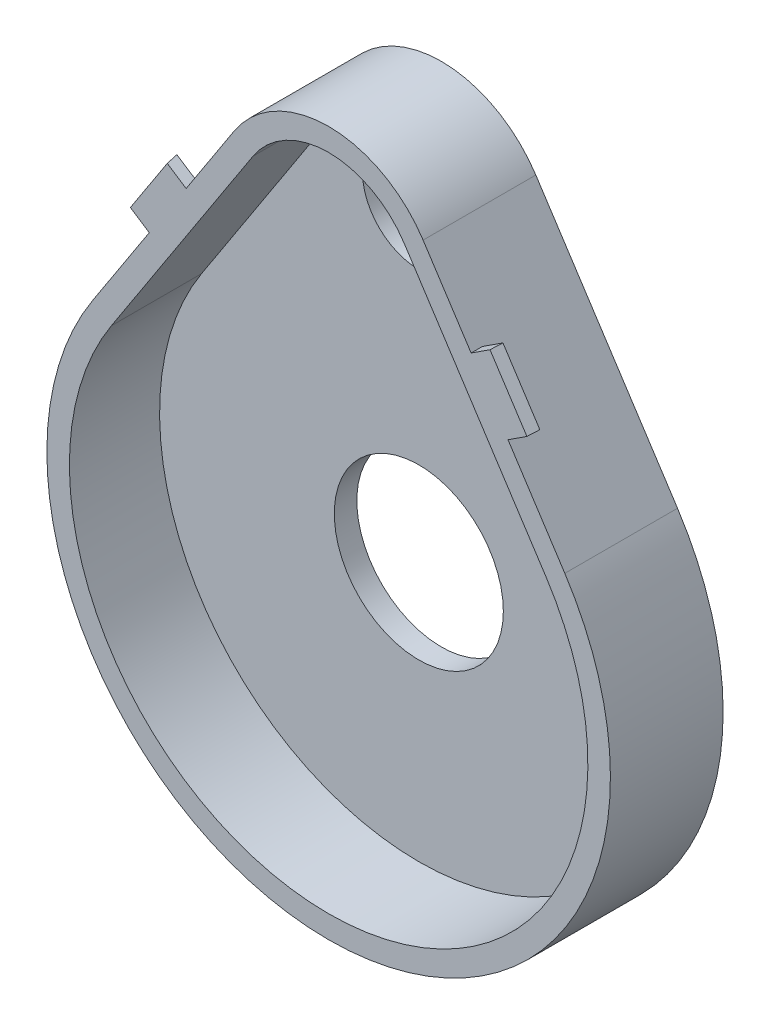
ISO-10303-21;
HEADER;
FILE_DESCRIPTION(('STEP AP214'),'2;1');
FILE_NAME('part.step','',(''),(''),'','','');
FILE_SCHEMA(('AUTOMOTIVE_DESIGN { 1 0 10303 214 1 1 1 1 }'));
ENDSEC;
DATA;
#1=APPLICATION_CONTEXT('core data for automotive mechanical design processes');
#2=APPLICATION_PROTOCOL_DEFINITION('international standard','automotive_design',2000,#1);
#3=PRODUCT_CONTEXT('',#1,'mechanical');
#4=PRODUCT('Part','Part','',(#3));
#5=PRODUCT_RELATED_PRODUCT_CATEGORY('part','',(#4));
#6=PRODUCT_DEFINITION_FORMATION('','',#4);
#7=PRODUCT_DEFINITION_CONTEXT('part definition',#1,'design');
#8=PRODUCT_DEFINITION('design','',#6,#7);
#9=PRODUCT_DEFINITION_SHAPE('','',#8);
#10=(LENGTH_UNIT() NAMED_UNIT(*) SI_UNIT(.MILLI.,.METRE.));
#11=(NAMED_UNIT(*) PLANE_ANGLE_UNIT() SI_UNIT($,.RADIAN.));
#12=(NAMED_UNIT(*) SI_UNIT($,.STERADIAN.) SOLID_ANGLE_UNIT());
#13=UNCERTAINTY_MEASURE_WITH_UNIT(LENGTH_MEASURE(1.E-05),#10,'distance_accuracy_value','');
#14=(GEOMETRIC_REPRESENTATION_CONTEXT(3) GLOBAL_UNCERTAINTY_ASSIGNED_CONTEXT((#13)) GLOBAL_UNIT_ASSIGNED_CONTEXT((#10,
#11,#12)) REPRESENTATION_CONTEXT('',''));
#15=CARTESIAN_POINT('',(0.,0.,0.));
#16=DIRECTION('',(0.,0.,1.));
#17=DIRECTION('',(1.,0.,0.));
#18=AXIS2_PLACEMENT_3D('',#15,#16,#17);
#19=CARTESIAN_POINT('',(-13.3054789326841,8.65909090909091,6.35));
#20=DIRECTION('',(-0.838140405208444,0.545454545454546,0.));
#21=DIRECTION('',(-0.545454545454546,-0.838140405208444,0.));
#22=AXIS2_PLACEMENT_3D('',#19,#20,#21);
#23=PLANE('',#22);
#24=DIRECTION('',(0.545454545454546,0.838140405208444,0.));
#25=VECTOR('',#24,1.);
#26=CARTESIAN_POINT('',(-13.3054789326841,8.65909090909091,6.35));
#27=LINE('',#26,#25);
#28=CARTESIAN_POINT('',(-13.3054789326841,8.65909090909091,6.35));
#29=VERTEX_POINT('',#28);
#30=CARTESIAN_POINT('',(-10.105298990747,13.5764577834285,6.35));
#31=VERTEX_POINT('',#30);
#32=EDGE_CURVE('E171',#29,#31,#27,.T.);
#33=ORIENTED_EDGE('',*,*,#32,.T.);
#34=DIRECTION('',(0.,0.,-1.));
#35=VECTOR('',#34,1.);
#36=CARTESIAN_POINT('',(-10.105298990747,13.5764577834285,11.3477380291522));
#37=LINE('',#36,#35);
#38=CARTESIAN_POINT('',(-10.105298990747,13.5764577834285,5.715));
#39=VERTEX_POINT('',#38);
#40=EDGE_CURVE('E86',#31,#39,#37,.T.);
#41=ORIENTED_EDGE('',*,*,#40,.T.);
#42=DIRECTION('',(0.545454545454545,0.838140405208444,0.));
#43=VECTOR('',#42,1.);
#44=CARTESIAN_POINT('',(-8.02711717256517,16.7697727272727,5.715));
#45=LINE('',#44,#43);
#46=CARTESIAN_POINT('',(-8.02711717256517,16.7697727272727,5.715));
#47=VERTEX_POINT('',#46);
#48=EDGE_CURVE('E248',#39,#47,#45,.T.);
#49=ORIENTED_EDGE('',*,*,#48,.T.);
#50=DIRECTION('',(0.,0.,-1.));
#51=VECTOR('',#50,1.);
#52=CARTESIAN_POINT('',(-8.02711717256517,16.7697727272727,11.3477380291522));
#53=LINE('',#52,#51);
#54=CARTESIAN_POINT('',(-8.02711717256517,16.7697727272727,6.35));
#55=VERTEX_POINT('',#54);
#56=EDGE_CURVE('E244',#55,#47,#53,.T.);
#57=ORIENTED_EDGE('',*,*,#56,.F.);
#58=CARTESIAN_POINT('',(-5.32219157307362,20.9261363636363,6.35));
#59=VERTEX_POINT('',#58);
#60=EDGE_CURVE('E180',#55,#59,#27,.T.);
#61=ORIENTED_EDGE('',*,*,#60,.T.);
#62=DIRECTION('',(0.,0.,-1.));
#63=VECTOR('',#62,1.);
#64=CARTESIAN_POINT('',(-5.32219157307362,20.9261363636363,6.35));
#65=LINE('',#64,#63);
#66=CARTESIAN_POINT('',(-5.32219157307362,20.9261363636363,0.));
#67=VERTEX_POINT('',#66);
#68=EDGE_CURVE('E188',#59,#67,#65,.T.);
#69=ORIENTED_EDGE('',*,*,#68,.T.);
#70=DIRECTION('',(0.545454545454546,0.838140405208444,0.));
#71=VECTOR('',#70,1.);
#72=CARTESIAN_POINT('',(-13.3054789326841,8.65909090909091,0.));
#73=LINE('',#72,#71);
#74=CARTESIAN_POINT('',(-13.3054789326841,8.65909090909091,0.));
#75=VERTEX_POINT('',#74);
#76=EDGE_CURVE('E189',#75,#67,#73,.T.);
#77=ORIENTED_EDGE('',*,*,#76,.F.);
#78=DIRECTION('',(0.,0.,-1.));
#79=VECTOR('',#78,1.);
#80=CARTESIAN_POINT('',(-13.3054789326841,8.65909090909091,6.35));
#81=LINE('',#80,#79);
#82=EDGE_CURVE('E11',#29,#75,#81,.T.);
#83=ORIENTED_EDGE('',*,*,#82,.F.);
#84=EDGE_LOOP('',(#33,#41,#49,#57,#61,#69,#77,#83));
#85=FACE_BOUND('',#84,.T.);
#86=ADVANCED_FACE('F39',(#85),#23,.T.);
#87=CARTESIAN_POINT('',(0.,17.4625,6.35));
#88=DIRECTION('',(0.,0.,1.));
#89=DIRECTION('',(1.,0.,0.));
#90=AXIS2_PLACEMENT_3D('',#87,#88,#89);
#91=PLANE('',#90);
#92=ORIENTED_EDGE('',*,*,#32,.F.);
#93=CARTESIAN_POINT('',(0.,0.,6.35));
#94=DIRECTION('',(0.,0.,1.));
#95=DIRECTION('',(1.,0.,0.));
#96=AXIS2_PLACEMENT_3D('',#93,#94,#95);
#97=CIRCLE('',#96,15.875);
#98=CARTESIAN_POINT('',(13.3054789326841,8.65909090909092,6.35));
#99=VERTEX_POINT('',#98);
#100=EDGE_CURVE('E187',#29,#99,#97,.T.);
#101=ORIENTED_EDGE('',*,*,#100,.T.);
#102=DIRECTION('',(-0.545454545454546,0.838140405208444,0.));
#103=VECTOR('',#102,1.);
#104=CARTESIAN_POINT('',(13.3054789326841,8.65909090909092,6.35));
#105=LINE('',#104,#103);
#106=CARTESIAN_POINT('',(10.105298990747,13.5764577834285,6.35));
#107=VERTEX_POINT('',#106);
#108=EDGE_CURVE('E181',#99,#107,#105,.T.);
#109=ORIENTED_EDGE('',*,*,#108,.T.);
#110=DIRECTION('',(0.838140405208444,0.545454545454546,0.));
#111=VECTOR('',#110,1.);
#112=CARTESIAN_POINT('',(11.1697373053617,14.2691850561558,6.35));
#113=LINE('',#112,#111);
#114=CARTESIAN_POINT('',(11.1697373053617,14.2691850561558,6.35));
#115=VERTEX_POINT('',#114);
#116=EDGE_CURVE('E334',#107,#115,#113,.T.);
#117=ORIENTED_EDGE('',*,*,#116,.T.);
#118=DIRECTION('',(-0.545454545454545,0.838140405208444,0.));
#119=VECTOR('',#118,1.);
#120=CARTESIAN_POINT('',(9.09155548717989,17.4625,6.35));
#121=LINE('',#120,#119);
#122=CARTESIAN_POINT('',(9.09155548717989,17.4625,6.35));
#123=VERTEX_POINT('',#122);
#124=EDGE_CURVE('E264',#115,#123,#121,.T.);
#125=ORIENTED_EDGE('',*,*,#124,.T.);
#126=DIRECTION('',(-0.838140405208444,-0.545454545454546,0.));
#127=VECTOR('',#126,1.);
#128=CARTESIAN_POINT('',(8.02711717256517,16.7697727272727,6.35));
#129=LINE('',#128,#127);
#130=CARTESIAN_POINT('',(8.02711717256517,16.7697727272727,6.35));
#131=VERTEX_POINT('',#130);
#132=EDGE_CURVE('E343',#123,#131,#129,.T.);
#133=ORIENTED_EDGE('',*,*,#132,.T.);
#134=CARTESIAN_POINT('',(5.32219157307362,20.9261363636364,6.35));
#135=VERTEX_POINT('',#134);
#136=EDGE_CURVE('E185',#131,#135,#105,.T.);
#137=ORIENTED_EDGE('',*,*,#136,.T.);
#138=CARTESIAN_POINT('',(0.,17.4625,6.35));
#139=DIRECTION('',(0.,0.,1.));
#140=DIRECTION('',(1.,0.,0.));
#141=AXIS2_PLACEMENT_3D('',#138,#139,#140);
#142=CIRCLE('',#141,6.35);
#143=EDGE_CURVE('E177',#135,#59,#142,.T.);
#144=ORIENTED_EDGE('',*,*,#143,.T.);
#145=ORIENTED_EDGE('',*,*,#60,.F.);
#146=DIRECTION('',(-0.838140405208444,0.545454545454546,0.));
#147=VECTOR('',#146,1.);
#148=CARTESIAN_POINT('',(-8.02711717256517,16.7697727272727,6.35));
#149=LINE('',#148,#147);
#150=CARTESIAN_POINT('',(-9.09155548717989,17.4625,6.35));
#151=VERTEX_POINT('',#150);
#152=EDGE_CURVE('E247',#55,#151,#149,.T.);
#153=ORIENTED_EDGE('',*,*,#152,.T.);
#154=DIRECTION('',(-0.545454545454545,-0.838140405208444,0.));
#155=VECTOR('',#154,1.);
#156=CARTESIAN_POINT('',(-9.09155548717989,17.4625,6.35));
#157=LINE('',#156,#155);
#158=CARTESIAN_POINT('',(-11.1697373053617,14.2691850561558,6.35));
#159=VERTEX_POINT('',#158);
#160=EDGE_CURVE('E253',#151,#159,#157,.T.);
#161=ORIENTED_EDGE('',*,*,#160,.T.);
#162=DIRECTION('',(0.838140405208444,-0.545454545454546,0.));
#163=VECTOR('',#162,1.);
#164=CARTESIAN_POINT('',(-11.1697373053617,14.2691850561558,6.35));
#165=LINE('',#164,#163);
#166=EDGE_CURVE('E255',#159,#31,#165,.T.);
#167=ORIENTED_EDGE('',*,*,#166,.T.);
#168=EDGE_LOOP('',(#92,#101,#109,#117,#125,#133,#137,#144,#145,#153,#161,#167));
#169=FACE_BOUND('',#168,.T.);
#170=CARTESIAN_POINT('',(0.,0.,6.35));
#171=DIRECTION('',(0.,0.,1.));
#172=DIRECTION('',(1.,0.,0.));
#173=AXIS2_PLACEMENT_3D('',#170,#171,#172);
#174=CIRCLE('',#173,14.605);
#175=CARTESIAN_POINT('',(-12.2410406180693,7.96636363636363,6.35));
#176=VERTEX_POINT('',#175);
#177=CARTESIAN_POINT('',(12.2410406180693,7.96636363636365,6.35));
#178=VERTEX_POINT('',#177);
#179=EDGE_CURVE('E163',#176,#178,#174,.T.);
#180=ORIENTED_EDGE('',*,*,#179,.F.);
#181=DIRECTION('',(0.545454545454546,0.838140405208444,0.));
#182=VECTOR('',#181,1.);
#183=CARTESIAN_POINT('',(-12.2410406180693,7.96636363636363,6.35));
#184=LINE('',#183,#182);
#185=CARTESIAN_POINT('',(-4.2577532584589,20.2334090909091,6.35));
#186=VERTEX_POINT('',#185);
#187=EDGE_CURVE('E166',#176,#186,#184,.T.);
#188=ORIENTED_EDGE('',*,*,#187,.T.);
#189=CARTESIAN_POINT('',(0.,17.4625,6.35));
#190=DIRECTION('',(0.,0.,1.));
#191=DIRECTION('',(1.,0.,0.));
#192=AXIS2_PLACEMENT_3D('',#189,#190,#191);
#193=CIRCLE('',#192,5.08);
#194=CARTESIAN_POINT('',(4.2577532584589,20.2334090909091,6.35));
#195=VERTEX_POINT('',#194);
#196=EDGE_CURVE('E146',#195,#186,#193,.T.);
#197=ORIENTED_EDGE('',*,*,#196,.F.);
#198=DIRECTION('',(-0.545454545454546,0.838140405208444,0.));
#199=VECTOR('',#198,1.);
#200=CARTESIAN_POINT('',(12.2410406180693,7.96636363636364,6.35));
#201=LINE('',#200,#199);
#202=EDGE_CURVE('E157',#178,#195,#201,.T.);
#203=ORIENTED_EDGE('',*,*,#202,.F.);
#204=EDGE_LOOP('',(#180,#188,#197,#203));
#205=FACE_BOUND('',#204,.T.);
#206=ADVANCED_FACE('F170',(#169,#205),#91,.T.);
#207=CARTESIAN_POINT('',(0.,0.,6.35));
#208=DIRECTION('',(0.,0.,-1.));
#209=DIRECTION('',(-1.,0.,0.));
#210=AXIS2_PLACEMENT_3D('',#207,#208,#209);
#211=CYLINDRICAL_SURFACE('',#210,15.875);
#212=CARTESIAN_POINT('',(0.,0.,0.));
#213=DIRECTION('',(0.,0.,1.));
#214=DIRECTION('',(1.,0.,0.));
#215=AXIS2_PLACEMENT_3D('',#212,#213,#214);
#216=CIRCLE('',#215,15.875);
#217=CARTESIAN_POINT('',(13.3054789326841,8.65909090909092,0.));
#218=VERTEX_POINT('',#217);
#219=EDGE_CURVE('E196',#75,#218,#216,.T.);
#220=ORIENTED_EDGE('',*,*,#219,.T.);
#221=DIRECTION('',(0.,0.,-1.));
#222=VECTOR('',#221,1.);
#223=CARTESIAN_POINT('',(13.3054789326841,8.65909090909092,6.35));
#224=LINE('',#223,#222);
#225=EDGE_CURVE('E47',#99,#218,#224,.T.);
#226=ORIENTED_EDGE('',*,*,#225,.F.);
#227=ORIENTED_EDGE('',*,*,#100,.F.);
#228=ORIENTED_EDGE('',*,*,#82,.T.);
#229=EDGE_LOOP('',(#220,#226,#227,#228));
#230=FACE_BOUND('',#229,.T.);
#231=ADVANCED_FACE('F305',(#230),#211,.T.);
#232=CARTESIAN_POINT('',(13.3054789326841,8.65909090909092,6.35));
#233=DIRECTION('',(-0.838140405208444,-0.545454545454546,0.));
#234=DIRECTION('',(0.545454545454546,-0.838140405208444,0.));
#235=AXIS2_PLACEMENT_3D('',#232,#233,#234);
#236=PLANE('',#235);
#237=ORIENTED_EDGE('',*,*,#136,.F.);
#238=DIRECTION('',(0.,0.,-1.));
#239=VECTOR('',#238,1.);
#240=CARTESIAN_POINT('',(8.02711717256517,16.7697727272727,11.3477380291522));
#241=LINE('',#240,#239);
#242=CARTESIAN_POINT('',(8.02711717256517,16.7697727272727,5.715));
#243=VERTEX_POINT('',#242);
#244=EDGE_CURVE('E228',#131,#243,#241,.T.);
#245=ORIENTED_EDGE('',*,*,#244,.T.);
#246=DIRECTION('',(0.545454545454545,-0.838140405208444,0.));
#247=VECTOR('',#246,1.);
#248=CARTESIAN_POINT('',(8.02711717256517,16.7697727272727,5.715));
#249=LINE('',#248,#247);
#250=CARTESIAN_POINT('',(10.105298990747,13.5764577834285,5.715));
#251=VERTEX_POINT('',#250);
#252=EDGE_CURVE('E234',#243,#251,#249,.T.);
#253=ORIENTED_EDGE('',*,*,#252,.T.);
#254=DIRECTION('',(0.,0.,-1.));
#255=VECTOR('',#254,1.);
#256=CARTESIAN_POINT('',(10.105298990747,13.5764577834285,11.3477380291522));
#257=LINE('',#256,#255);
#258=EDGE_CURVE('E239',#107,#251,#257,.T.);
#259=ORIENTED_EDGE('',*,*,#258,.F.);
#260=ORIENTED_EDGE('',*,*,#108,.F.);
#261=ORIENTED_EDGE('',*,*,#225,.T.);
#262=DIRECTION('',(-0.545454545454546,0.838140405208444,0.));
#263=VECTOR('',#262,1.);
#264=CARTESIAN_POINT('',(13.3054789326841,8.65909090909092,0.));
#265=LINE('',#264,#263);
#266=CARTESIAN_POINT('',(5.32219157307362,20.9261363636364,0.));
#267=VERTEX_POINT('',#266);
#268=EDGE_CURVE('E198',#218,#267,#265,.T.);
#269=ORIENTED_EDGE('',*,*,#268,.T.);
#270=DIRECTION('',(0.,0.,-1.));
#271=VECTOR('',#270,1.);
#272=CARTESIAN_POINT('',(5.32219157307362,20.9261363636364,6.35));
#273=LINE('',#272,#271);
#274=EDGE_CURVE('E205',#135,#267,#273,.T.);
#275=ORIENTED_EDGE('',*,*,#274,.F.);
#276=EDGE_LOOP('',(#237,#245,#253,#259,#260,#261,#269,#275));
#277=FACE_BOUND('',#276,.T.);
#278=ADVANCED_FACE('F348',(#277),#236,.F.);
#279=CARTESIAN_POINT('',(0.,17.4625,6.35));
#280=DIRECTION('',(0.,0.,-1.));
#281=DIRECTION('',(-1.,0.,0.));
#282=AXIS2_PLACEMENT_3D('',#279,#280,#281);
#283=CYLINDRICAL_SURFACE('',#282,6.35);
#284=CARTESIAN_POINT('',(0.,17.4625,0.));
#285=DIRECTION('',(0.,0.,1.));
#286=DIRECTION('',(1.,0.,0.));
#287=AXIS2_PLACEMENT_3D('',#284,#285,#286);
#288=CIRCLE('',#287,6.35);
#289=EDGE_CURVE('E194',#267,#67,#288,.T.);
#290=ORIENTED_EDGE('',*,*,#289,.T.);
#291=ORIENTED_EDGE('',*,*,#68,.F.);
#292=ORIENTED_EDGE('',*,*,#143,.F.);
#293=ORIENTED_EDGE('',*,*,#274,.T.);
#294=EDGE_LOOP('',(#290,#291,#292,#293));
#295=FACE_BOUND('',#294,.T.);
#296=ADVANCED_FACE('F307',(#295),#283,.T.);
#297=CARTESIAN_POINT('',(0.,17.4625,0.));
#298=DIRECTION('',(0.,0.,1.));
#299=DIRECTION('',(1.,0.,0.));
#300=AXIS2_PLACEMENT_3D('',#297,#298,#299);
#301=PLANE('',#300);
#302=CARTESIAN_POINT('',(0.,17.4625,0.));
#303=DIRECTION('',(0.,0.,1.));
#304=DIRECTION('',(1.,0.,0.));
#305=AXIS2_PLACEMENT_3D('',#302,#303,#304);
#306=CIRCLE('',#305,3.175);
#307=CARTESIAN_POINT('',(3.175,17.4625,0.));
#308=VERTEX_POINT('',#307);
#309=EDGE_CURVE('E209',#308,#308,#306,.T.);
#310=ORIENTED_EDGE('',*,*,#309,.T.);
#311=EDGE_LOOP('',(#310));
#312=FACE_BOUND('',#311,.T.);
#313=CARTESIAN_POINT('',(0.,0.,0.));
#314=DIRECTION('',(0.,0.,1.));
#315=DIRECTION('',(1.,0.,0.));
#316=AXIS2_PLACEMENT_3D('',#313,#314,#315);
#317=CIRCLE('',#316,4.7625);
#318=CARTESIAN_POINT('',(4.7625,0.,0.));
#319=VERTEX_POINT('',#318);
#320=EDGE_CURVE('E265',#319,#319,#317,.T.);
#321=ORIENTED_EDGE('',*,*,#320,.T.);
#322=EDGE_LOOP('',(#321));
#323=FACE_BOUND('',#322,.T.);
#324=ORIENTED_EDGE('',*,*,#76,.T.);
#325=ORIENTED_EDGE('',*,*,#289,.F.);
#326=ORIENTED_EDGE('',*,*,#268,.F.);
#327=ORIENTED_EDGE('',*,*,#219,.F.);
#328=EDGE_LOOP('',(#324,#325,#326,#327));
#329=FACE_BOUND('',#328,.T.);
#330=ADVANCED_FACE('F380',(#312,#323,#329),#301,.F.);
#331=CARTESIAN_POINT('',(-12.2410406180693,7.96636363636363,6.35));
#332=DIRECTION('',(-0.838140405208444,0.545454545454546,0.));
#333=DIRECTION('',(-0.545454545454546,-0.838140405208444,0.));
#334=AXIS2_PLACEMENT_3D('',#331,#332,#333);
#335=PLANE('',#334);
#336=DIRECTION('',(0.545454545454546,0.838140405208444,0.));
#337=VECTOR('',#336,1.);
#338=CARTESIAN_POINT('',(-12.2410406180693,7.96636363636363,1.27));
#339=LINE('',#338,#337);
#340=CARTESIAN_POINT('',(-12.2410406180693,7.96636363636364,1.27));
#341=VERTEX_POINT('',#340);
#342=CARTESIAN_POINT('',(-4.2577532584589,20.2334090909091,1.27));
#343=VERTEX_POINT('',#342);
#344=EDGE_CURVE('E213',#341,#343,#339,.T.);
#345=ORIENTED_EDGE('',*,*,#344,.T.);
#346=DIRECTION('',(0.,0.,1.));
#347=VECTOR('',#346,1.);
#348=CARTESIAN_POINT('',(-4.2577532584589,20.2334090909091,6.35));
#349=LINE('',#348,#347);
#350=EDGE_CURVE('E154',#186,#343,#349,.F.);
#351=ORIENTED_EDGE('',*,*,#350,.F.);
#352=ORIENTED_EDGE('',*,*,#187,.F.);
#353=DIRECTION('',(0.,0.,-1.));
#354=VECTOR('',#353,1.);
#355=CARTESIAN_POINT('',(-12.2410406180693,7.96636363636364,6.35));
#356=LINE('',#355,#354);
#357=EDGE_CURVE('E192',#176,#341,#356,.T.);
#358=ORIENTED_EDGE('',*,*,#357,.T.);
#359=EDGE_LOOP('',(#345,#351,#352,#358));
#360=FACE_BOUND('',#359,.T.);
#361=ADVANCED_FACE('F276',(#360),#335,.F.);
#362=CARTESIAN_POINT('',(0.,0.,6.35));
#363=DIRECTION('',(0.,0.,-1.));
#364=DIRECTION('',(-1.,0.,0.));
#365=AXIS2_PLACEMENT_3D('',#362,#363,#364);
#366=CYLINDRICAL_SURFACE('',#365,14.605);
#367=CARTESIAN_POINT('',(0.,0.,1.27));
#368=DIRECTION('',(0.,0.,1.));
#369=DIRECTION('',(1.,0.,0.));
#370=AXIS2_PLACEMENT_3D('',#367,#368,#369);
#371=CIRCLE('',#370,14.605);
#372=CARTESIAN_POINT('',(12.2410406180693,7.96636363636365,1.27));
#373=VERTEX_POINT('',#372);
#374=EDGE_CURVE('E172',#341,#373,#371,.T.);
#375=ORIENTED_EDGE('',*,*,#374,.F.);
#376=ORIENTED_EDGE('',*,*,#357,.F.);
#377=ORIENTED_EDGE('',*,*,#179,.T.);
#378=DIRECTION('',(0.,0.,1.));
#379=VECTOR('',#378,1.);
#380=CARTESIAN_POINT('',(12.2410406180693,7.96636363636365,6.35));
#381=LINE('',#380,#379);
#382=EDGE_CURVE('E152',#178,#373,#381,.F.);
#383=ORIENTED_EDGE('',*,*,#382,.T.);
#384=EDGE_LOOP('',(#375,#376,#377,#383));
#385=FACE_BOUND('',#384,.T.);
#386=ADVANCED_FACE('F277',(#385),#366,.F.);
#387=CARTESIAN_POINT('',(12.2410406180693,7.96636363636364,6.35));
#388=DIRECTION('',(-0.838140405208444,-0.545454545454546,0.));
#389=DIRECTION('',(0.545454545454546,-0.838140405208444,0.));
#390=AXIS2_PLACEMENT_3D('',#387,#388,#389);
#391=PLANE('',#390);
#392=DIRECTION('',(-0.545454545454546,0.838140405208444,0.));
#393=VECTOR('',#392,1.);
#394=CARTESIAN_POINT('',(12.2410406180693,7.96636363636364,1.27));
#395=LINE('',#394,#393);
#396=CARTESIAN_POINT('',(4.25775325845889,20.2334090909091,1.27));
#397=VERTEX_POINT('',#396);
#398=EDGE_CURVE('E271',#373,#397,#395,.T.);
#399=ORIENTED_EDGE('',*,*,#398,.F.);
#400=ORIENTED_EDGE('',*,*,#382,.F.);
#401=ORIENTED_EDGE('',*,*,#202,.T.);
#402=DIRECTION('',(0.,0.,-1.));
#403=VECTOR('',#402,1.);
#404=CARTESIAN_POINT('',(4.25775325845889,20.2334090909091,6.35));
#405=LINE('',#404,#403);
#406=EDGE_CURVE('E145',#195,#397,#405,.T.);
#407=ORIENTED_EDGE('',*,*,#406,.T.);
#408=EDGE_LOOP('',(#399,#400,#401,#407));
#409=FACE_BOUND('',#408,.T.);
#410=ADVANCED_FACE('F159',(#409),#391,.T.);
#411=CARTESIAN_POINT('',(0.,17.4625,6.35));
#412=DIRECTION('',(0.,0.,-1.));
#413=DIRECTION('',(-1.,0.,0.));
#414=AXIS2_PLACEMENT_3D('',#411,#412,#413);
#415=CYLINDRICAL_SURFACE('',#414,5.08);
#416=CARTESIAN_POINT('',(0.,17.4625,1.27));
#417=DIRECTION('',(0.,0.,1.));
#418=DIRECTION('',(1.,0.,0.));
#419=AXIS2_PLACEMENT_3D('',#416,#417,#418);
#420=CIRCLE('',#419,5.08);
#421=EDGE_CURVE('E151',#397,#343,#420,.T.);
#422=ORIENTED_EDGE('',*,*,#421,.F.);
#423=ORIENTED_EDGE('',*,*,#406,.F.);
#424=ORIENTED_EDGE('',*,*,#196,.T.);
#425=ORIENTED_EDGE('',*,*,#350,.T.);
#426=EDGE_LOOP('',(#422,#423,#424,#425));
#427=FACE_BOUND('',#426,.T.);
#428=ADVANCED_FACE('F148',(#427),#415,.F.);
#429=CARTESIAN_POINT('',(0.,17.4625,1.27));
#430=DIRECTION('',(0.,0.,1.));
#431=DIRECTION('',(1.,0.,0.));
#432=AXIS2_PLACEMENT_3D('',#429,#430,#431);
#433=PLANE('',#432);
#434=CARTESIAN_POINT('',(0.,17.4625,1.27));
#435=DIRECTION('',(0.,0.,1.));
#436=DIRECTION('',(1.,0.,0.));
#437=AXIS2_PLACEMENT_3D('',#434,#435,#436);
#438=CIRCLE('',#437,3.175);
#439=CARTESIAN_POINT('',(3.175,17.4625,1.27));
#440=VERTEX_POINT('',#439);
#441=EDGE_CURVE('E207',#440,#440,#438,.F.);
#442=ORIENTED_EDGE('',*,*,#441,.T.);
#443=EDGE_LOOP('',(#442));
#444=FACE_BOUND('',#443,.T.);
#445=CARTESIAN_POINT('',(0.,0.,1.27));
#446=DIRECTION('',(0.,0.,1.));
#447=DIRECTION('',(1.,0.,0.));
#448=AXIS2_PLACEMENT_3D('',#445,#446,#447);
#449=CIRCLE('',#448,4.7625);
#450=CARTESIAN_POINT('',(4.7625,0.,1.27));
#451=VERTEX_POINT('',#450);
#452=EDGE_CURVE('E206',#451,#451,#449,.F.);
#453=ORIENTED_EDGE('',*,*,#452,.T.);
#454=EDGE_LOOP('',(#453));
#455=FACE_BOUND('',#454,.T.);
#456=ORIENTED_EDGE('',*,*,#344,.F.);
#457=ORIENTED_EDGE('',*,*,#374,.T.);
#458=ORIENTED_EDGE('',*,*,#398,.T.);
#459=ORIENTED_EDGE('',*,*,#421,.T.);
#460=EDGE_LOOP('',(#456,#457,#458,#459));
#461=FACE_BOUND('',#460,.T.);
#462=ADVANCED_FACE('F282',(#444,#455,#461),#433,.T.);
#463=CARTESIAN_POINT('',(0.,0.,6.35));
#464=DIRECTION('',(0.,0.,-1.));
#465=DIRECTION('',(-1.,0.,0.));
#466=AXIS2_PLACEMENT_3D('',#463,#464,#465);
#467=CYLINDRICAL_SURFACE('',#466,4.7625);
#468=ORIENTED_EDGE('',*,*,#452,.F.);
#469=EDGE_LOOP('',(#468));
#470=FACE_BOUND('',#469,.T.);
#471=ORIENTED_EDGE('',*,*,#320,.F.);
#472=EDGE_LOOP('',(#471));
#473=FACE_BOUND('',#472,.T.);
#474=ADVANCED_FACE('F283',(#470,#473),#467,.F.);
#475=CARTESIAN_POINT('',(0.,17.4625,6.35));
#476=DIRECTION('',(0.,0.,-1.));
#477=DIRECTION('',(-1.,0.,0.));
#478=AXIS2_PLACEMENT_3D('',#475,#476,#477);
#479=CYLINDRICAL_SURFACE('',#478,3.175);
#480=ORIENTED_EDGE('',*,*,#441,.F.);
#481=EDGE_LOOP('',(#480));
#482=FACE_BOUND('',#481,.T.);
#483=ORIENTED_EDGE('',*,*,#309,.F.);
#484=EDGE_LOOP('',(#483));
#485=FACE_BOUND('',#484,.T.);
#486=ADVANCED_FACE('F286',(#482,#485),#479,.F.);
#487=CARTESIAN_POINT('',(11.1697373053617,14.2691850561558,11.3477380291522));
#488=DIRECTION('',(-0.545454545454545,0.838140405208444,0.));
#489=DIRECTION('',(-0.838140405208444,-0.545454545454546,0.));
#490=AXIS2_PLACEMENT_3D('',#487,#488,#489);
#491=PLANE('',#490);
#492=ORIENTED_EDGE('',*,*,#116,.F.);
#493=ORIENTED_EDGE('',*,*,#258,.T.);
#494=DIRECTION('',(0.838140405208444,0.545454545454545,0.));
#495=VECTOR('',#494,1.);
#496=CARTESIAN_POINT('',(11.1697373053617,14.2691850561558,5.715));
#497=LINE('',#496,#495);
#498=CARTESIAN_POINT('',(11.2635819024449,14.330258310383,5.715));
#499=VERTEX_POINT('',#498);
#500=EDGE_CURVE('E225',#251,#499,#497,.T.);
#501=ORIENTED_EDGE('',*,*,#500,.T.);
#502=DIRECTION('',(-0.145541553993469,-0.0947171878183259,0.984807753012208));
#503=VECTOR('',#502,1.);
#504=CARTESIAN_POINT('',(11.1697373053617,14.2691850561558,6.35));
#505=LINE('',#504,#503);
#506=EDGE_CURVE('E219',#115,#499,#505,.F.);
#507=ORIENTED_EDGE('',*,*,#506,.F.);
#508=EDGE_LOOP('',(#492,#493,#501,#507));
#509=FACE_BOUND('',#508,.T.);
#510=ADVANCED_FACE('F315',(#509),#491,.F.);
#511=CARTESIAN_POINT('',(9.09155548717989,17.4625,6.35));
#512=DIRECTION('',(0.82540716916207,0.537167865279386,0.173648177666931));
#513=DIRECTION('',(-0.145541553993469,-0.0947171878183258,0.984807753012208));
#514=AXIS2_PLACEMENT_3D('',#511,#512,#513);
#515=PLANE('',#514);
#516=ORIENTED_EDGE('',*,*,#124,.F.);
#517=ORIENTED_EDGE('',*,*,#506,.T.);
#518=DIRECTION('',(0.545454545454545,-0.838140405208444,0.));
#519=VECTOR('',#518,1.);
#520=CARTESIAN_POINT('',(14.463761844382,9.41289143604538,5.715));
#521=LINE('',#520,#519);
#522=CARTESIAN_POINT('',(9.1854000842631,17.5235732542272,5.715));
#523=VERTEX_POINT('',#522);
#524=EDGE_CURVE('E220',#499,#523,#521,.F.);
#525=ORIENTED_EDGE('',*,*,#524,.T.);
#526=DIRECTION('',(-0.145541553993469,-0.094717187818326,0.984807753012208));
#527=VECTOR('',#526,1.);
#528=CARTESIAN_POINT('',(8.34313070014531,16.9754316049173,11.4142205788956));
#529=LINE('',#528,#527);
#530=EDGE_CURVE('E212',#123,#523,#529,.F.);
#531=ORIENTED_EDGE('',*,*,#530,.F.);
#532=EDGE_LOOP('',(#516,#517,#525,#531));
#533=FACE_BOUND('',#532,.T.);
#534=ADVANCED_FACE('F310',(#533),#515,.T.);
#535=CARTESIAN_POINT('',(8.02711717256517,16.7697727272727,11.3477380291522));
#536=DIRECTION('',(0.545454545454546,-0.838140405208444,0.));
#537=DIRECTION('',(0.838140405208444,0.545454545454546,0.));
#538=AXIS2_PLACEMENT_3D('',#535,#536,#537);
#539=PLANE('',#538);
#540=ORIENTED_EDGE('',*,*,#132,.F.);
#541=ORIENTED_EDGE('',*,*,#530,.T.);
#542=DIRECTION('',(-0.838140405208444,-0.545454545454546,0.));
#543=VECTOR('',#542,1.);
#544=CARTESIAN_POINT('',(8.02711717256517,16.7697727272727,5.715));
#545=LINE('',#544,#543);
#546=EDGE_CURVE('E216',#523,#243,#545,.T.);
#547=ORIENTED_EDGE('',*,*,#546,.T.);
#548=ORIENTED_EDGE('',*,*,#244,.F.);
#549=EDGE_LOOP('',(#540,#541,#547,#548));
#550=FACE_BOUND('',#549,.T.);
#551=ADVANCED_FACE('F313',(#550),#539,.F.);
#552=CARTESIAN_POINT('',(0.,0.,5.715));
#553=DIRECTION('',(0.,0.,-1.));
#554=DIRECTION('',(-1.,0.,0.));
#555=AXIS2_PLACEMENT_3D('',#552,#553,#554);
#556=PLANE('',#555);
#557=ORIENTED_EDGE('',*,*,#252,.F.);
#558=ORIENTED_EDGE('',*,*,#546,.F.);
#559=ORIENTED_EDGE('',*,*,#524,.F.);
#560=ORIENTED_EDGE('',*,*,#500,.F.);
#561=EDGE_LOOP('',(#557,#558,#559,#560));
#562=FACE_BOUND('',#561,.T.);
#563=ADVANCED_FACE('F318',(#562),#556,.T.);
#564=CARTESIAN_POINT('',(-9.09155548717989,17.4625,6.35));
#565=DIRECTION('',(-0.82540716916207,0.537167865279386,0.173648177666931));
#566=DIRECTION('',(0.145541553993469,-0.0947171878183258,0.984807753012208));
#567=AXIS2_PLACEMENT_3D('',#564,#565,#566);
#568=PLANE('',#567);
#569=ORIENTED_EDGE('',*,*,#160,.F.);
#570=DIRECTION('',(0.145541553993469,-0.094717187818326,0.984807753012208));
#571=VECTOR('',#570,1.);
#572=CARTESIAN_POINT('',(-9.09155548717989,17.4625,6.35));
#573=LINE('',#572,#571);
#574=CARTESIAN_POINT('',(-9.1854000842631,17.5235732542272,5.715));
#575=VERTEX_POINT('',#574);
#576=EDGE_CURVE('E43',#151,#575,#573,.F.);
#577=ORIENTED_EDGE('',*,*,#576,.T.);
#578=DIRECTION('',(0.545454545454545,0.838140405208444,0.));
#579=VECTOR('',#578,1.);
#580=CARTESIAN_POINT('',(-9.1854000842631,17.5235732542272,5.715));
#581=LINE('',#580,#579);
#582=CARTESIAN_POINT('',(-11.2635819024449,14.330258310383,5.715));
#583=VERTEX_POINT('',#582);
#584=EDGE_CURVE('E224',#575,#583,#581,.F.);
#585=ORIENTED_EDGE('',*,*,#584,.T.);
#586=DIRECTION('',(0.145541553993469,-0.0947171878183259,0.984807753012208));
#587=VECTOR('',#586,1.);
#588=CARTESIAN_POINT('',(-10.4534092608719,13.8030049442372,11.1970377878838));
#589=LINE('',#588,#587);
#590=EDGE_CURVE('E83',#159,#583,#589,.F.);
#591=ORIENTED_EDGE('',*,*,#590,.F.);
#592=EDGE_LOOP('',(#569,#577,#585,#591));
#593=FACE_BOUND('',#592,.T.);
#594=ADVANCED_FACE('F41',(#593),#568,.T.);
#595=CARTESIAN_POINT('',(-11.1697373053617,14.2691850561558,11.3477380291522));
#596=DIRECTION('',(0.545454545454545,0.838140405208444,0.));
#597=DIRECTION('',(-0.838140405208444,0.545454545454546,0.));
#598=AXIS2_PLACEMENT_3D('',#595,#596,#597);
#599=PLANE('',#598);
#600=ORIENTED_EDGE('',*,*,#166,.F.);
#601=ORIENTED_EDGE('',*,*,#590,.T.);
#602=DIRECTION('',(0.838140405208444,-0.545454545454545,0.));
#603=VECTOR('',#602,1.);
#604=CARTESIAN_POINT('',(-11.1697373053617,14.2691850561558,5.715));
#605=LINE('',#604,#603);
#606=EDGE_CURVE('E221',#583,#39,#605,.T.);
#607=ORIENTED_EDGE('',*,*,#606,.T.);
#608=ORIENTED_EDGE('',*,*,#40,.F.);
#609=EDGE_LOOP('',(#600,#601,#607,#608));
#610=FACE_BOUND('',#609,.T.);
#611=ADVANCED_FACE('F362',(#610),#599,.F.);
#612=CARTESIAN_POINT('',(-8.02711717256517,16.7697727272727,11.3477380291522));
#613=DIRECTION('',(-0.545454545454546,-0.838140405208444,0.));
#614=DIRECTION('',(0.838140405208444,-0.545454545454546,0.));
#615=AXIS2_PLACEMENT_3D('',#612,#613,#614);
#616=PLANE('',#615);
#617=ORIENTED_EDGE('',*,*,#152,.F.);
#618=ORIENTED_EDGE('',*,*,#56,.T.);
#619=DIRECTION('',(-0.838140405208444,0.545454545454546,0.));
#620=VECTOR('',#619,1.);
#621=CARTESIAN_POINT('',(-8.02711717256517,16.7697727272727,5.715));
#622=LINE('',#621,#620);
#623=EDGE_CURVE('E59',#47,#575,#622,.T.);
#624=ORIENTED_EDGE('',*,*,#623,.T.);
#625=ORIENTED_EDGE('',*,*,#576,.F.);
#626=EDGE_LOOP('',(#617,#618,#624,#625));
#627=FACE_BOUND('',#626,.T.);
#628=ADVANCED_FACE('F351',(#627),#616,.F.);
#629=CARTESIAN_POINT('',(0.,0.,5.715));
#630=DIRECTION('',(0.,0.,1.));
#631=DIRECTION('',(1.,0.,0.));
#632=AXIS2_PLACEMENT_3D('',#629,#630,#631);
#633=PLANE('',#632);
#634=ORIENTED_EDGE('',*,*,#584,.F.);
#635=ORIENTED_EDGE('',*,*,#623,.F.);
#636=ORIENTED_EDGE('',*,*,#48,.F.);
#637=ORIENTED_EDGE('',*,*,#606,.F.);
#638=EDGE_LOOP('',(#634,#635,#636,#637));
#639=FACE_BOUND('',#638,.T.);
#640=ADVANCED_FACE('F363',(#639),#633,.F.);
#641=CLOSED_SHELL('',(#86,#206,#231,#278,#296,#330,#361,#386,#410,#428,#462,#474,#486,#510,#534,
#551,#563,#594,#611,#628,#640));
#642=MANIFOLD_SOLID_BREP('B2',#641);
#643=ADVANCED_BREP_SHAPE_REPRESENTATION('',(#18,#642),#14);
#644=SHAPE_DEFINITION_REPRESENTATION(#9,#643);
ENDSEC;
END-ISO-10303-21;
